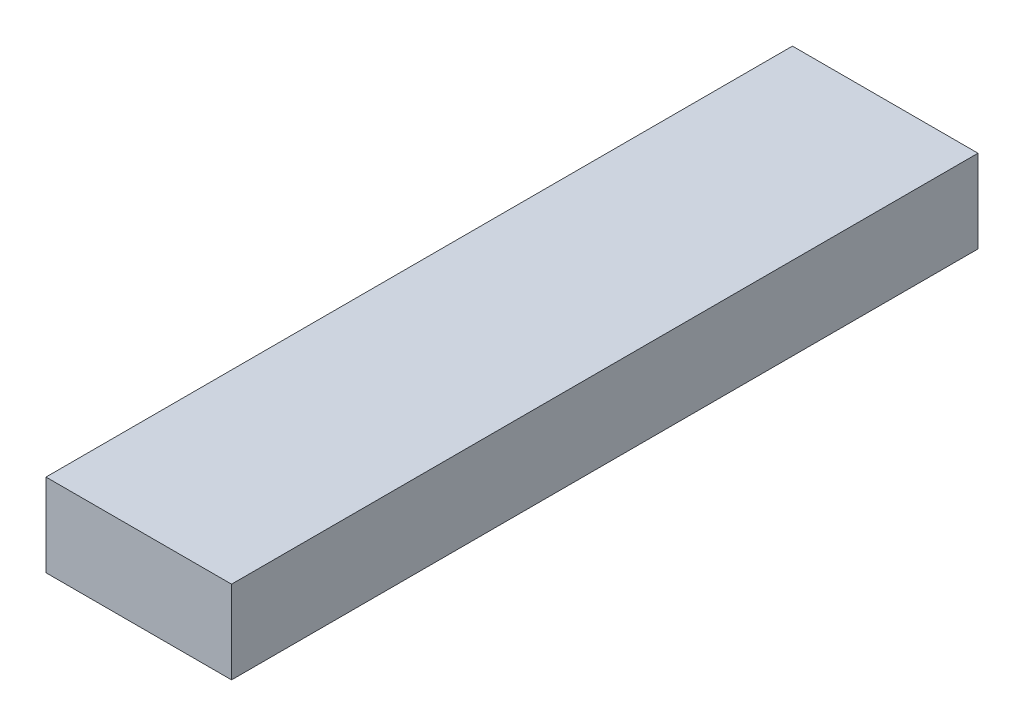
ISO-10303-21;
HEADER;
FILE_DESCRIPTION(('STEP AP214'),'2;1');
FILE_NAME('part.step','',(''),(''),'','','');
FILE_SCHEMA(('AUTOMOTIVE_DESIGN { 1 0 10303 214 1 1 1 1 }'));
ENDSEC;
DATA;
#1=APPLICATION_CONTEXT('core data for automotive mechanical design processes');
#2=APPLICATION_PROTOCOL_DEFINITION('international standard','automotive_design',2000,#1);
#3=PRODUCT_CONTEXT('',#1,'mechanical');
#4=PRODUCT('Part','Part','',(#3));
#5=PRODUCT_RELATED_PRODUCT_CATEGORY('part','',(#4));
#6=PRODUCT_DEFINITION_FORMATION('','',#4);
#7=PRODUCT_DEFINITION_CONTEXT('part definition',#1,'design');
#8=PRODUCT_DEFINITION('design','',#6,#7);
#9=PRODUCT_DEFINITION_SHAPE('','',#8);
#10=(LENGTH_UNIT() NAMED_UNIT(*) SI_UNIT(.MILLI.,.METRE.));
#11=(NAMED_UNIT(*) PLANE_ANGLE_UNIT() SI_UNIT($,.RADIAN.));
#12=(NAMED_UNIT(*) SI_UNIT($,.STERADIAN.) SOLID_ANGLE_UNIT());
#13=UNCERTAINTY_MEASURE_WITH_UNIT(LENGTH_MEASURE(1.E-05),#10,'distance_accuracy_value','');
#14=(GEOMETRIC_REPRESENTATION_CONTEXT(3) GLOBAL_UNCERTAINTY_ASSIGNED_CONTEXT((#13)) GLOBAL_UNIT_ASSIGNED_CONTEXT((#10,
#11,#12)) REPRESENTATION_CONTEXT('',''));
#15=CARTESIAN_POINT('',(0.,0.,0.));
#16=DIRECTION('',(0.,0.,1.));
#17=DIRECTION('',(1.,0.,0.));
#18=AXIS2_PLACEMENT_3D('',#15,#16,#17);
#19=CARTESIAN_POINT('',(18.6436,8.3312,75.));
#20=DIRECTION('',(0.,-1.,0.));
#21=DIRECTION('',(0.,0.,-1.));
#22=AXIS2_PLACEMENT_3D('',#19,#20,#21);
#23=PLANE('',#22);
#24=DIRECTION('',(-1.,0.,0.));
#25=VECTOR('',#24,1.);
#26=CARTESIAN_POINT('',(18.6436,8.3312,-75.));
#27=LINE('',#26,#25);
#28=CARTESIAN_POINT('',(18.6436,8.3312,-75.));
#29=VERTEX_POINT('',#28);
#30=CARTESIAN_POINT('',(-18.6436,8.3312,-75.));
#31=VERTEX_POINT('',#30);
#32=EDGE_CURVE('E102',#29,#31,#27,.T.);
#33=ORIENTED_EDGE('',*,*,#32,.T.);
#34=DIRECTION('',(0.,0.,-1.));
#35=VECTOR('',#34,1.);
#36=CARTESIAN_POINT('',(-18.6436,8.3312,75.));
#37=LINE('',#36,#35);
#38=CARTESIAN_POINT('',(-18.6436,8.3312,75.));
#39=VERTEX_POINT('',#38);
#40=EDGE_CURVE('E11',#39,#31,#37,.T.);
#41=ORIENTED_EDGE('',*,*,#40,.F.);
#42=DIRECTION('',(-1.,0.,0.));
#43=VECTOR('',#42,1.);
#44=CARTESIAN_POINT('',(18.6436,8.3312,75.));
#45=LINE('',#44,#43);
#46=CARTESIAN_POINT('',(18.6436,8.3312,75.));
#47=VERTEX_POINT('',#46);
#48=EDGE_CURVE('E95',#47,#39,#45,.T.);
#49=ORIENTED_EDGE('',*,*,#48,.F.);
#50=DIRECTION('',(0.,0.,-1.));
#51=VECTOR('',#50,1.);
#52=CARTESIAN_POINT('',(18.6436,8.3312,75.));
#53=LINE('',#52,#51);
#54=EDGE_CURVE('E99',#47,#29,#53,.T.);
#55=ORIENTED_EDGE('',*,*,#54,.T.);
#56=EDGE_LOOP('',(#33,#41,#49,#55));
#57=FACE_BOUND('',#56,.T.);
#58=ADVANCED_FACE('F41',(#57),#23,.F.);
#59=CARTESIAN_POINT('',(-18.6436,-8.3312,75.));
#60=DIRECTION('',(1.,0.,0.));
#61=DIRECTION('',(0.,0.,-1.));
#62=AXIS2_PLACEMENT_3D('',#59,#60,#61);
#63=PLANE('',#62);
#64=DIRECTION('',(0.,-1.,0.));
#65=VECTOR('',#64,1.);
#66=CARTESIAN_POINT('',(-18.6436,-8.3312,-75.));
#67=LINE('',#66,#65);
#68=CARTESIAN_POINT('',(-18.6436,-8.3312,-75.));
#69=VERTEX_POINT('',#68);
#70=EDGE_CURVE('E96',#31,#69,#67,.T.);
#71=ORIENTED_EDGE('',*,*,#70,.T.);
#72=DIRECTION('',(0.,0.,-1.));
#73=VECTOR('',#72,1.);
#74=CARTESIAN_POINT('',(-18.6436,-8.3312,75.));
#75=LINE('',#74,#73);
#76=CARTESIAN_POINT('',(-18.6436,-8.3312,75.));
#77=VERTEX_POINT('',#76);
#78=EDGE_CURVE('E47',#77,#69,#75,.T.);
#79=ORIENTED_EDGE('',*,*,#78,.F.);
#80=DIRECTION('',(0.,-1.,0.));
#81=VECTOR('',#80,1.);
#82=CARTESIAN_POINT('',(-18.6436,-8.3312,75.));
#83=LINE('',#82,#81);
#84=EDGE_CURVE('E87',#39,#77,#83,.T.);
#85=ORIENTED_EDGE('',*,*,#84,.F.);
#86=ORIENTED_EDGE('',*,*,#40,.T.);
#87=EDGE_LOOP('',(#71,#79,#85,#86));
#88=FACE_BOUND('',#87,.T.);
#89=ADVANCED_FACE('F92',(#88),#63,.F.);
#90=CARTESIAN_POINT('',(18.6436,-8.3312,75.));
#91=DIRECTION('',(0.,1.,0.));
#92=DIRECTION('',(0.,0.,1.));
#93=AXIS2_PLACEMENT_3D('',#90,#91,#92);
#94=PLANE('',#93);
#95=DIRECTION('',(1.,0.,0.));
#96=VECTOR('',#95,1.);
#97=CARTESIAN_POINT('',(18.6436,-8.3312,-75.));
#98=LINE('',#97,#96);
#99=CARTESIAN_POINT('',(18.6436,-8.3312,-75.));
#100=VERTEX_POINT('',#99);
#101=EDGE_CURVE('E74',#69,#100,#98,.T.);
#102=ORIENTED_EDGE('',*,*,#101,.T.);
#103=DIRECTION('',(0.,0.,-1.));
#104=VECTOR('',#103,1.);
#105=CARTESIAN_POINT('',(18.6436,-8.3312,75.));
#106=LINE('',#105,#104);
#107=CARTESIAN_POINT('',(18.6436,-8.3312,75.));
#108=VERTEX_POINT('',#107);
#109=EDGE_CURVE('E100',#108,#100,#106,.T.);
#110=ORIENTED_EDGE('',*,*,#109,.F.);
#111=DIRECTION('',(1.,0.,0.));
#112=VECTOR('',#111,1.);
#113=CARTESIAN_POINT('',(18.6436,-8.3312,75.));
#114=LINE('',#113,#112);
#115=EDGE_CURVE('E89',#77,#108,#114,.T.);
#116=ORIENTED_EDGE('',*,*,#115,.F.);
#117=ORIENTED_EDGE('',*,*,#78,.T.);
#118=EDGE_LOOP('',(#102,#110,#116,#117));
#119=FACE_BOUND('',#118,.T.);
#120=ADVANCED_FACE('F98',(#119),#94,.F.);
#121=CARTESIAN_POINT('',(18.6436,-8.3312,75.));
#122=DIRECTION('',(-1.,0.,0.));
#123=DIRECTION('',(0.,0.,1.));
#124=AXIS2_PLACEMENT_3D('',#121,#122,#123);
#125=PLANE('',#124);
#126=DIRECTION('',(0.,1.,0.));
#127=VECTOR('',#126,1.);
#128=CARTESIAN_POINT('',(18.6436,-8.3312,-75.));
#129=LINE('',#128,#127);
#130=EDGE_CURVE('E77',#100,#29,#129,.T.);
#131=ORIENTED_EDGE('',*,*,#130,.T.);
#132=ORIENTED_EDGE('',*,*,#54,.F.);
#133=DIRECTION('',(0.,1.,0.));
#134=VECTOR('',#133,1.);
#135=CARTESIAN_POINT('',(18.6436,-8.3312,75.));
#136=LINE('',#135,#134);
#137=EDGE_CURVE('E60',#108,#47,#136,.T.);
#138=ORIENTED_EDGE('',*,*,#137,.F.);
#139=ORIENTED_EDGE('',*,*,#109,.T.);
#140=EDGE_LOOP('',(#131,#132,#138,#139));
#141=FACE_BOUND('',#140,.T.);
#142=ADVANCED_FACE('F112',(#141),#125,.F.);
#143=CARTESIAN_POINT('',(0.,0.,75.));
#144=DIRECTION('',(0.,0.,-1.));
#145=DIRECTION('',(-1.,0.,0.));
#146=AXIS2_PLACEMENT_3D('',#143,#144,#145);
#147=PLANE('',#146);
#148=ORIENTED_EDGE('',*,*,#48,.T.);
#149=ORIENTED_EDGE('',*,*,#84,.T.);
#150=ORIENTED_EDGE('',*,*,#115,.T.);
#151=ORIENTED_EDGE('',*,*,#137,.T.);
#152=EDGE_LOOP('',(#148,#149,#150,#151));
#153=FACE_BOUND('',#152,.T.);
#154=ADVANCED_FACE('F86',(#153),#147,.F.);
#155=CARTESIAN_POINT('',(0.,0.,-75.));
#156=DIRECTION('',(0.,0.,-1.));
#157=DIRECTION('',(-1.,0.,0.));
#158=AXIS2_PLACEMENT_3D('',#155,#156,#157);
#159=PLANE('',#158);
#160=ORIENTED_EDGE('',*,*,#32,.F.);
#161=ORIENTED_EDGE('',*,*,#130,.F.);
#162=ORIENTED_EDGE('',*,*,#101,.F.);
#163=ORIENTED_EDGE('',*,*,#70,.F.);
#164=EDGE_LOOP('',(#160,#161,#162,#163));
#165=FACE_BOUND('',#164,.T.);
#166=ADVANCED_FACE('F111',(#165),#159,.T.);
#167=CLOSED_SHELL('',(#58,#89,#120,#142,#154,#166));
#168=MANIFOLD_SOLID_BREP('B2',#167);
#169=ADVANCED_BREP_SHAPE_REPRESENTATION('',(#18,#168),#14);
#170=SHAPE_DEFINITION_REPRESENTATION(#9,#169);
ENDSEC;
END-ISO-10303-21;
